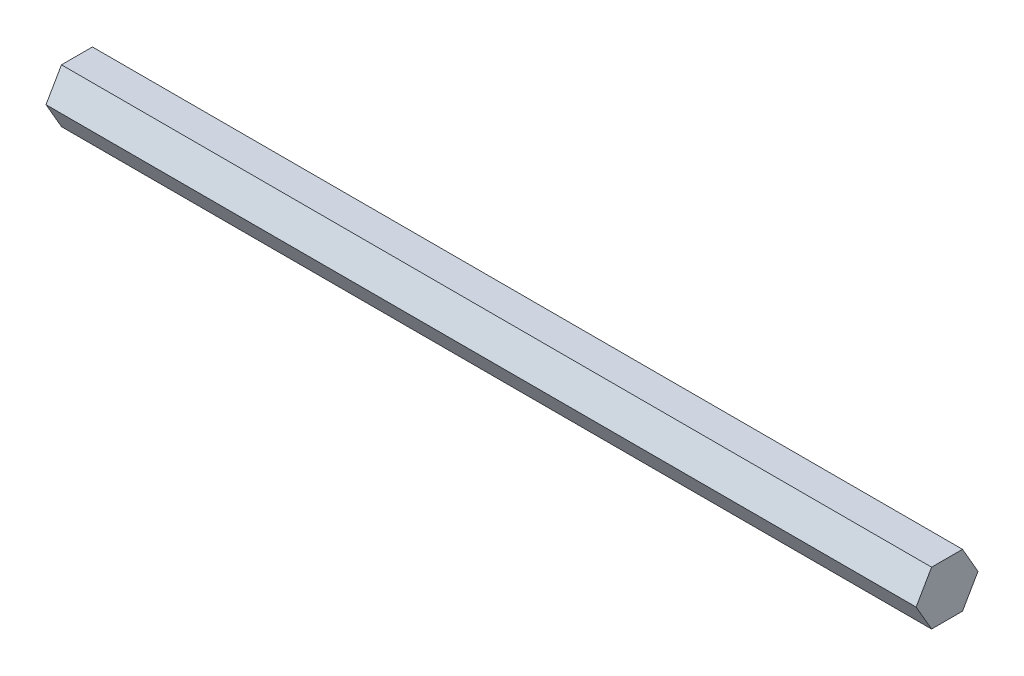
ISO-10303-21;
HEADER;
FILE_DESCRIPTION(('STEP AP214'),'2;1');
FILE_NAME('part.step','',(''),(''),'','','');
FILE_SCHEMA(('AUTOMOTIVE_DESIGN { 1 0 10303 214 1 1 1 1 }'));
ENDSEC;
DATA;
#1=APPLICATION_CONTEXT('core data for automotive mechanical design processes');
#2=APPLICATION_PROTOCOL_DEFINITION('international standard','automotive_design',2000,#1);
#3=PRODUCT_CONTEXT('',#1,'mechanical');
#4=PRODUCT('Part','Part','',(#3));
#5=PRODUCT_RELATED_PRODUCT_CATEGORY('part','',(#4));
#6=PRODUCT_DEFINITION_FORMATION('','',#4);
#7=PRODUCT_DEFINITION_CONTEXT('part definition',#1,'design');
#8=PRODUCT_DEFINITION('design','',#6,#7);
#9=PRODUCT_DEFINITION_SHAPE('','',#8);
#10=(LENGTH_UNIT() NAMED_UNIT(*) SI_UNIT(.MILLI.,.METRE.));
#11=(NAMED_UNIT(*) PLANE_ANGLE_UNIT() SI_UNIT($,.RADIAN.));
#12=(NAMED_UNIT(*) SI_UNIT($,.STERADIAN.) SOLID_ANGLE_UNIT());
#13=UNCERTAINTY_MEASURE_WITH_UNIT(LENGTH_MEASURE(1.E-05),#10,'distance_accuracy_value','');
#14=(GEOMETRIC_REPRESENTATION_CONTEXT(3) GLOBAL_UNCERTAINTY_ASSIGNED_CONTEXT((#13)) GLOBAL_UNIT_ASSIGNED_CONTEXT((#10,
#11,#12)) REPRESENTATION_CONTEXT('',''));
#15=CARTESIAN_POINT('',(0.,0.,0.));
#16=DIRECTION('',(0.,0.,1.));
#17=DIRECTION('',(1.,0.,0.));
#18=AXIS2_PLACEMENT_3D('',#15,#16,#17);
#19=CARTESIAN_POINT('',(206.1972,0.,-7.33234841870825));
#20=DIRECTION('',(0.,-0.5,0.866025403784439));
#21=DIRECTION('',(0.,-0.866025403784438,-0.5));
#22=AXIS2_PLACEMENT_3D('',#19,#20,#21);
#23=PLANE('',#22);
#24=DIRECTION('',(0.,0.866025403784438,0.5));
#25=VECTOR('',#24,1.);
#26=CARTESIAN_POINT('',(0.,0.,-7.33234841870825));
#27=LINE('',#26,#25);
#28=CARTESIAN_POINT('',(0.,0.,-7.33234841870825));
#29=VERTEX_POINT('',#28);
#30=CARTESIAN_POINT('',(0.,6.35,-3.66617420935412));
#31=VERTEX_POINT('',#30);
#32=EDGE_CURVE('E123',#29,#31,#27,.T.);
#33=ORIENTED_EDGE('',*,*,#32,.T.);
#34=DIRECTION('',(-1.,0.,0.));
#35=VECTOR('',#34,1.);
#36=CARTESIAN_POINT('',(206.1972,6.35,-3.66617420935412));
#37=LINE('',#36,#35);
#38=CARTESIAN_POINT('',(206.1972,6.35,-3.66617420935412));
#39=VERTEX_POINT('',#38);
#40=EDGE_CURVE('E11',#39,#31,#37,.T.);
#41=ORIENTED_EDGE('',*,*,#40,.F.);
#42=DIRECTION('',(0.,0.866025403784438,0.5));
#43=VECTOR('',#42,1.);
#44=CARTESIAN_POINT('',(206.1972,0.,-7.33234841870825));
#45=LINE('',#44,#43);
#46=CARTESIAN_POINT('',(206.1972,0.,-7.33234841870825));
#47=VERTEX_POINT('',#46);
#48=EDGE_CURVE('E133',#47,#39,#45,.T.);
#49=ORIENTED_EDGE('',*,*,#48,.F.);
#50=DIRECTION('',(-1.,0.,0.));
#51=VECTOR('',#50,1.);
#52=CARTESIAN_POINT('',(206.1972,0.,-7.33234841870825));
#53=LINE('',#52,#51);
#54=EDGE_CURVE('E119',#47,#29,#53,.T.);
#55=ORIENTED_EDGE('',*,*,#54,.T.);
#56=EDGE_LOOP('',(#33,#41,#49,#55));
#57=FACE_BOUND('',#56,.T.);
#58=ADVANCED_FACE('F39',(#57),#23,.F.);
#59=CARTESIAN_POINT('',(206.1972,6.35,-3.66617420935412));
#60=DIRECTION('',(0.,-1.,0.));
#61=DIRECTION('',(0.,0.,-1.));
#62=AXIS2_PLACEMENT_3D('',#59,#60,#61);
#63=PLANE('',#62);
#64=DIRECTION('',(0.,0.,1.));
#65=VECTOR('',#64,1.);
#66=CARTESIAN_POINT('',(0.,6.35,-3.66617420935412));
#67=LINE('',#66,#65);
#68=CARTESIAN_POINT('',(0.,6.35,3.66617420935412));
#69=VERTEX_POINT('',#68);
#70=EDGE_CURVE('E126',#31,#69,#67,.T.);
#71=ORIENTED_EDGE('',*,*,#70,.T.);
#72=DIRECTION('',(-1.,0.,0.));
#73=VECTOR('',#72,1.);
#74=CARTESIAN_POINT('',(206.1972,6.35,3.66617420935412));
#75=LINE('',#74,#73);
#76=CARTESIAN_POINT('',(206.1972,6.35,3.66617420935412));
#77=VERTEX_POINT('',#76);
#78=EDGE_CURVE('E47',#77,#69,#75,.T.);
#79=ORIENTED_EDGE('',*,*,#78,.F.);
#80=DIRECTION('',(0.,0.,1.));
#81=VECTOR('',#80,1.);
#82=CARTESIAN_POINT('',(206.1972,6.35,-3.66617420935412));
#83=LINE('',#82,#81);
#84=EDGE_CURVE('E92',#39,#77,#83,.T.);
#85=ORIENTED_EDGE('',*,*,#84,.F.);
#86=ORIENTED_EDGE('',*,*,#40,.T.);
#87=EDGE_LOOP('',(#71,#79,#85,#86));
#88=FACE_BOUND('',#87,.T.);
#89=ADVANCED_FACE('F157',(#88),#63,.F.);
#90=CARTESIAN_POINT('',(206.1972,6.35,3.66617420935412));
#91=DIRECTION('',(0.,-0.5,-0.866025403784439));
#92=DIRECTION('',(0.,0.866025403784439,-0.5));
#93=AXIS2_PLACEMENT_3D('',#90,#91,#92);
#94=PLANE('',#93);
#95=DIRECTION('',(0.,-0.866025403784439,0.5));
#96=VECTOR('',#95,1.);
#97=CARTESIAN_POINT('',(0.,6.35,3.66617420935412));
#98=LINE('',#97,#96);
#99=CARTESIAN_POINT('',(0.,0.,7.33234841870824));
#100=VERTEX_POINT('',#99);
#101=EDGE_CURVE('E128',#69,#100,#98,.T.);
#102=ORIENTED_EDGE('',*,*,#101,.T.);
#103=DIRECTION('',(-1.,0.,0.));
#104=VECTOR('',#103,1.);
#105=CARTESIAN_POINT('',(206.1972,0.,7.33234841870824));
#106=LINE('',#105,#104);
#107=CARTESIAN_POINT('',(206.1972,0.,7.33234841870824));
#108=VERTEX_POINT('',#107);
#109=EDGE_CURVE('E114',#108,#100,#106,.T.);
#110=ORIENTED_EDGE('',*,*,#109,.F.);
#111=DIRECTION('',(0.,-0.866025403784439,0.5));
#112=VECTOR('',#111,1.);
#113=CARTESIAN_POINT('',(206.1972,6.35,3.66617420935412));
#114=LINE('',#113,#112);
#115=EDGE_CURVE('E105',#77,#108,#114,.T.);
#116=ORIENTED_EDGE('',*,*,#115,.F.);
#117=ORIENTED_EDGE('',*,*,#78,.T.);
#118=EDGE_LOOP('',(#102,#110,#116,#117));
#119=FACE_BOUND('',#118,.T.);
#120=ADVANCED_FACE('F139',(#119),#94,.F.);
#121=CARTESIAN_POINT('',(206.1972,0.,7.33234841870824));
#122=DIRECTION('',(0.,0.5,-0.866025403784439));
#123=DIRECTION('',(0.,0.866025403784439,0.5));
#124=AXIS2_PLACEMENT_3D('',#121,#122,#123);
#125=PLANE('',#124);
#126=DIRECTION('',(0.,-0.866025403784438,-0.5));
#127=VECTOR('',#126,1.);
#128=CARTESIAN_POINT('',(0.,0.,7.33234841870824));
#129=LINE('',#128,#127);
#130=CARTESIAN_POINT('',(0.,-6.35,3.66617420935412));
#131=VERTEX_POINT('',#130);
#132=EDGE_CURVE('E113',#100,#131,#129,.T.);
#133=ORIENTED_EDGE('',*,*,#132,.T.);
#134=DIRECTION('',(-1.,0.,0.));
#135=VECTOR('',#134,1.);
#136=CARTESIAN_POINT('',(206.1972,-6.35,3.66617420935412));
#137=LINE('',#136,#135);
#138=CARTESIAN_POINT('',(206.1972,-6.35,3.66617420935412));
#139=VERTEX_POINT('',#138);
#140=EDGE_CURVE('E110',#139,#131,#137,.T.);
#141=ORIENTED_EDGE('',*,*,#140,.F.);
#142=DIRECTION('',(0.,-0.866025403784438,-0.5));
#143=VECTOR('',#142,1.);
#144=CARTESIAN_POINT('',(206.1972,0.,7.33234841870824));
#145=LINE('',#144,#143);
#146=EDGE_CURVE('E99',#108,#139,#145,.T.);
#147=ORIENTED_EDGE('',*,*,#146,.F.);
#148=ORIENTED_EDGE('',*,*,#109,.T.);
#149=EDGE_LOOP('',(#133,#141,#147,#148));
#150=FACE_BOUND('',#149,.T.);
#151=ADVANCED_FACE('F111',(#150),#125,.F.);
#152=CARTESIAN_POINT('',(206.1972,-6.35,3.66617420935412));
#153=DIRECTION('',(0.,1.,0.));
#154=DIRECTION('',(0.,0.,1.));
#155=AXIS2_PLACEMENT_3D('',#152,#153,#154);
#156=PLANE('',#155);
#157=DIRECTION('',(0.,0.,-1.));
#158=VECTOR('',#157,1.);
#159=CARTESIAN_POINT('',(0.,-6.35,3.66617420935412));
#160=LINE('',#159,#158);
#161=CARTESIAN_POINT('',(0.,-6.35,-3.66617420935412));
#162=VERTEX_POINT('',#161);
#163=EDGE_CURVE('E78',#131,#162,#160,.T.);
#164=ORIENTED_EDGE('',*,*,#163,.T.);
#165=DIRECTION('',(-1.,0.,0.));
#166=VECTOR('',#165,1.);
#167=CARTESIAN_POINT('',(206.1972,-6.35,-3.66617420935412));
#168=LINE('',#167,#166);
#169=CARTESIAN_POINT('',(206.1972,-6.35,-3.66617420935412));
#170=VERTEX_POINT('',#169);
#171=EDGE_CURVE('E115',#170,#162,#168,.T.);
#172=ORIENTED_EDGE('',*,*,#171,.F.);
#173=DIRECTION('',(0.,0.,-1.));
#174=VECTOR('',#173,1.);
#175=CARTESIAN_POINT('',(206.1972,-6.35,3.66617420935412));
#176=LINE('',#175,#174);
#177=EDGE_CURVE('E103',#139,#170,#176,.T.);
#178=ORIENTED_EDGE('',*,*,#177,.F.);
#179=ORIENTED_EDGE('',*,*,#140,.T.);
#180=EDGE_LOOP('',(#164,#172,#178,#179));
#181=FACE_BOUND('',#180,.T.);
#182=ADVANCED_FACE('F117',(#181),#156,.F.);
#183=CARTESIAN_POINT('',(206.1972,-6.35,-3.66617420935412));
#184=DIRECTION('',(0.,0.5,0.866025403784439));
#185=DIRECTION('',(0.,-0.866025403784439,0.5));
#186=AXIS2_PLACEMENT_3D('',#183,#184,#185);
#187=PLANE('',#186);
#188=DIRECTION('',(0.,0.866025403784439,-0.5));
#189=VECTOR('',#188,1.);
#190=CARTESIAN_POINT('',(0.,-6.35,-3.66617420935412));
#191=LINE('',#190,#189);
#192=EDGE_CURVE('E84',#162,#29,#191,.T.);
#193=ORIENTED_EDGE('',*,*,#192,.T.);
#194=ORIENTED_EDGE('',*,*,#54,.F.);
#195=DIRECTION('',(0.,0.866025403784439,-0.5));
#196=VECTOR('',#195,1.);
#197=CARTESIAN_POINT('',(206.1972,-6.35,-3.66617420935412));
#198=LINE('',#197,#196);
#199=EDGE_CURVE('E55',#170,#47,#198,.T.);
#200=ORIENTED_EDGE('',*,*,#199,.F.);
#201=ORIENTED_EDGE('',*,*,#171,.T.);
#202=EDGE_LOOP('',(#193,#194,#200,#201));
#203=FACE_BOUND('',#202,.T.);
#204=ADVANCED_FACE('F146',(#203),#187,.F.);
#205=CARTESIAN_POINT('',(206.1972,0.,0.));
#206=DIRECTION('',(1.,0.,0.));
#207=DIRECTION('',(0.,0.,-1.));
#208=AXIS2_PLACEMENT_3D('',#205,#206,#207);
#209=PLANE('',#208);
#210=ORIENTED_EDGE('',*,*,#48,.T.);
#211=ORIENTED_EDGE('',*,*,#84,.T.);
#212=ORIENTED_EDGE('',*,*,#115,.T.);
#213=ORIENTED_EDGE('',*,*,#146,.T.);
#214=ORIENTED_EDGE('',*,*,#177,.T.);
#215=ORIENTED_EDGE('',*,*,#199,.T.);
#216=EDGE_LOOP('',(#210,#211,#212,#213,#214,#215));
#217=FACE_BOUND('',#216,.T.);
#218=ADVANCED_FACE('F101',(#217),#209,.T.);
#219=CARTESIAN_POINT('',(0.,0.,0.));
#220=DIRECTION('',(1.,0.,0.));
#221=DIRECTION('',(0.,0.,-1.));
#222=AXIS2_PLACEMENT_3D('',#219,#220,#221);
#223=PLANE('',#222);
#224=ORIENTED_EDGE('',*,*,#32,.F.);
#225=ORIENTED_EDGE('',*,*,#192,.F.);
#226=ORIENTED_EDGE('',*,*,#163,.F.);
#227=ORIENTED_EDGE('',*,*,#132,.F.);
#228=ORIENTED_EDGE('',*,*,#101,.F.);
#229=ORIENTED_EDGE('',*,*,#70,.F.);
#230=EDGE_LOOP('',(#224,#225,#226,#227,#228,#229));
#231=FACE_BOUND('',#230,.T.);
#232=ADVANCED_FACE('F142',(#231),#223,.F.);
#233=CLOSED_SHELL('',(#58,#89,#120,#151,#182,#204,#218,#232));
#234=MANIFOLD_SOLID_BREP('B2',#233);
#235=ADVANCED_BREP_SHAPE_REPRESENTATION('',(#18,#234),#14);
#236=SHAPE_DEFINITION_REPRESENTATION(#9,#235);
ENDSEC;
END-ISO-10303-21;
